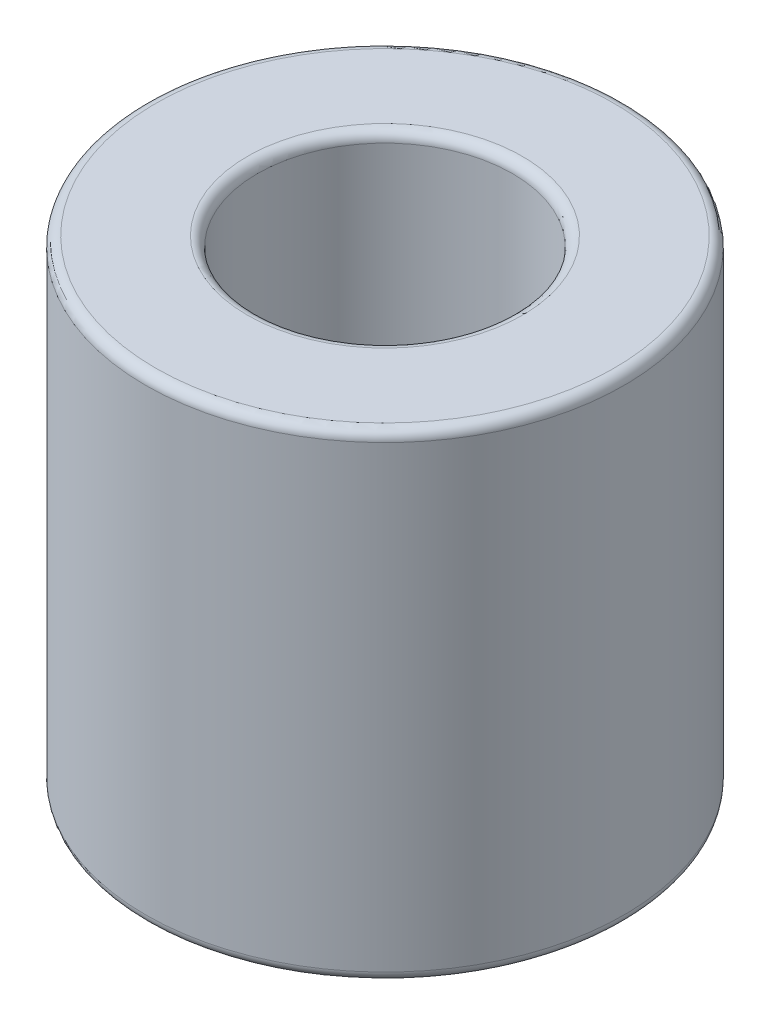
ISO-10303-21;
HEADER;
FILE_DESCRIPTION(('STEP AP214'),'2;1');
FILE_NAME('part.step','',(''),(''),'','','');
FILE_SCHEMA(('AUTOMOTIVE_DESIGN { 1 0 10303 214 1 1 1 1 }'));
ENDSEC;
DATA;
#1=APPLICATION_CONTEXT('core data for automotive mechanical design processes');
#2=APPLICATION_PROTOCOL_DEFINITION('international standard','automotive_design',2000,#1);
#3=PRODUCT_CONTEXT('',#1,'mechanical');
#4=PRODUCT('Part','Part','',(#3));
#5=PRODUCT_RELATED_PRODUCT_CATEGORY('part','',(#4));
#6=PRODUCT_DEFINITION_FORMATION('','',#4);
#7=PRODUCT_DEFINITION_CONTEXT('part definition',#1,'design');
#8=PRODUCT_DEFINITION('design','',#6,#7);
#9=PRODUCT_DEFINITION_SHAPE('','',#8);
#10=(LENGTH_UNIT() NAMED_UNIT(*) SI_UNIT(.MILLI.,.METRE.));
#11=(NAMED_UNIT(*) PLANE_ANGLE_UNIT() SI_UNIT($,.RADIAN.));
#12=(NAMED_UNIT(*) SI_UNIT($,.STERADIAN.) SOLID_ANGLE_UNIT());
#13=UNCERTAINTY_MEASURE_WITH_UNIT(LENGTH_MEASURE(1.E-05),#10,'distance_accuracy_value','');
#14=(GEOMETRIC_REPRESENTATION_CONTEXT(3) GLOBAL_UNCERTAINTY_ASSIGNED_CONTEXT((#13)) GLOBAL_UNIT_ASSIGNED_CONTEXT((#10,
#11,#12)) REPRESENTATION_CONTEXT('',''));
#15=CARTESIAN_POINT('',(0.,0.,0.));
#16=DIRECTION('',(0.,0.,1.));
#17=DIRECTION('',(1.,0.,0.));
#18=AXIS2_PLACEMENT_3D('',#15,#16,#17);
#19=CARTESIAN_POINT('',(0.,6.,0.));
#20=DIRECTION('',(0.,1.,0.));
#21=DIRECTION('',(0.,0.,1.));
#22=AXIS2_PLACEMENT_3D('',#19,#20,#21);
#23=PLANE('',#22);
#24=CARTESIAN_POINT('',(0.,6.,0.));
#25=DIRECTION('',(0.,1.,0.));
#26=DIRECTION('',(0.,0.,1.));
#27=AXIS2_PLACEMENT_3D('',#24,#25,#26);
#28=CIRCLE('',#27,1.725);
#29=CARTESIAN_POINT('',(0.,6.,1.725));
#30=VERTEX_POINT('',#29);
#31=EDGE_CURVE('E50',#30,#30,#28,.F.);
#32=ORIENTED_EDGE('',*,*,#31,.T.);
#33=EDGE_LOOP('',(#32));
#34=FACE_BOUND('',#33,.T.);
#35=CARTESIAN_POINT('',(0.,6.,0.));
#36=DIRECTION('',(0.,1.,0.));
#37=DIRECTION('',(0.,0.,1.));
#38=AXIS2_PLACEMENT_3D('',#35,#36,#37);
#39=CIRCLE('',#38,2.875);
#40=CARTESIAN_POINT('',(0.,6.,2.875));
#41=VERTEX_POINT('',#40);
#42=EDGE_CURVE('E54',#41,#41,#39,.T.);
#43=ORIENTED_EDGE('',*,*,#42,.T.);
#44=EDGE_LOOP('',(#43));
#45=FACE_BOUND('',#44,.T.);
#46=ADVANCED_FACE('F39',(#34,#45),#23,.T.);
#47=CARTESIAN_POINT('',(0.,0.,0.));
#48=DIRECTION('',(0.,1.,0.));
#49=DIRECTION('',(0.,0.,1.));
#50=AXIS2_PLACEMENT_3D('',#47,#48,#49);
#51=PLANE('',#50);
#52=CARTESIAN_POINT('',(0.,0.,0.));
#53=DIRECTION('',(0.,1.,0.));
#54=DIRECTION('',(0.,0.,1.));
#55=AXIS2_PLACEMENT_3D('',#52,#53,#54);
#56=CIRCLE('',#55,1.725);
#57=CARTESIAN_POINT('',(0.,0.,1.725));
#58=VERTEX_POINT('',#57);
#59=EDGE_CURVE('E65',#58,#58,#56,.T.);
#60=ORIENTED_EDGE('',*,*,#59,.T.);
#61=EDGE_LOOP('',(#60));
#62=FACE_BOUND('',#61,.T.);
#63=CARTESIAN_POINT('',(0.,0.,0.));
#64=DIRECTION('',(0.,1.,0.));
#65=DIRECTION('',(0.,0.,1.));
#66=AXIS2_PLACEMENT_3D('',#63,#64,#65);
#67=CIRCLE('',#66,2.875);
#68=CARTESIAN_POINT('',(0.,0.,2.875));
#69=VERTEX_POINT('',#68);
#70=EDGE_CURVE('E68',#69,#69,#67,.F.);
#71=ORIENTED_EDGE('',*,*,#70,.T.);
#72=EDGE_LOOP('',(#71));
#73=FACE_BOUND('',#72,.T.);
#74=ADVANCED_FACE('F72',(#62,#73),#51,.F.);
#75=CARTESIAN_POINT('',(0.,6.,0.));
#76=DIRECTION('',(0.,-1.,0.));
#77=DIRECTION('',(0.,0.,-1.));
#78=AXIS2_PLACEMENT_3D('',#75,#76,#77);
#79=CYLINDRICAL_SURFACE('',#78,3.);
#80=CARTESIAN_POINT('',(0.,0.125,0.));
#81=DIRECTION('',(0.,1.,0.));
#82=DIRECTION('',(0.,0.,1.));
#83=AXIS2_PLACEMENT_3D('',#80,#81,#82);
#84=CIRCLE('',#83,3.);
#85=CARTESIAN_POINT('',(0.,0.125,3.));
#86=VERTEX_POINT('',#85);
#87=EDGE_CURVE('E10',#86,#86,#84,.T.);
#88=ORIENTED_EDGE('',*,*,#87,.T.);
#89=EDGE_LOOP('',(#88));
#90=FACE_BOUND('',#89,.T.);
#91=CARTESIAN_POINT('',(0.,5.875,0.));
#92=DIRECTION('',(0.,1.,0.));
#93=DIRECTION('',(0.,0.,1.));
#94=AXIS2_PLACEMENT_3D('',#91,#92,#93);
#95=CIRCLE('',#94,3.);
#96=CARTESIAN_POINT('',(0.,5.875,3.));
#97=VERTEX_POINT('',#96);
#98=EDGE_CURVE('E46',#97,#97,#95,.F.);
#99=ORIENTED_EDGE('',*,*,#98,.T.);
#100=EDGE_LOOP('',(#99));
#101=FACE_BOUND('',#100,.T.);
#102=ADVANCED_FACE('F92',(#90,#101),#79,.T.);
#103=CARTESIAN_POINT('',(0.,6.,0.));
#104=DIRECTION('',(0.,-1.,0.));
#105=DIRECTION('',(0.,0.,-1.));
#106=AXIS2_PLACEMENT_3D('',#103,#104,#105);
#107=CYLINDRICAL_SURFACE('',#106,1.6);
#108=CARTESIAN_POINT('',(0.,0.125,0.));
#109=DIRECTION('',(0.,1.,0.));
#110=DIRECTION('',(0.,0.,1.));
#111=AXIS2_PLACEMENT_3D('',#108,#109,#110);
#112=CIRCLE('',#111,1.6);
#113=CARTESIAN_POINT('',(0.,0.125,1.6));
#114=VERTEX_POINT('',#113);
#115=EDGE_CURVE('E59',#114,#114,#112,.F.);
#116=ORIENTED_EDGE('',*,*,#115,.T.);
#117=EDGE_LOOP('',(#116));
#118=FACE_BOUND('',#117,.T.);
#119=CARTESIAN_POINT('',(0.,5.875,0.));
#120=DIRECTION('',(0.,1.,0.));
#121=DIRECTION('',(0.,0.,1.));
#122=AXIS2_PLACEMENT_3D('',#119,#120,#121);
#123=CIRCLE('',#122,1.6);
#124=CARTESIAN_POINT('',(0.,5.875,1.6));
#125=VERTEX_POINT('',#124);
#126=EDGE_CURVE('E62',#125,#125,#123,.T.);
#127=ORIENTED_EDGE('',*,*,#126,.T.);
#128=EDGE_LOOP('',(#127));
#129=FACE_BOUND('',#128,.T.);
#130=ADVANCED_FACE('F97',(#118,#129),#107,.F.);
#131=CARTESIAN_POINT('',(0.,0.125,0.));
#132=DIRECTION('',(0.,1.,0.));
#133=DIRECTION('',(0.,0.,1.));
#134=AXIS2_PLACEMENT_3D('',#131,#132,#133);
#135=TOROIDAL_SURFACE('',#134,1.725,0.125);
#136=ORIENTED_EDGE('',*,*,#115,.F.);
#137=EDGE_LOOP('',(#136));
#138=FACE_BOUND('',#137,.T.);
#139=ORIENTED_EDGE('',*,*,#59,.F.);
#140=EDGE_LOOP('',(#139));
#141=FACE_BOUND('',#140,.T.);
#142=ADVANCED_FACE('F83',(#138,#141),#135,.T.);
#143=CARTESIAN_POINT('',(0.,5.875,0.));
#144=DIRECTION('',(0.,1.,0.));
#145=DIRECTION('',(0.,0.,1.));
#146=AXIS2_PLACEMENT_3D('',#143,#144,#145);
#147=TOROIDAL_SURFACE('',#146,1.725,0.125);
#148=ORIENTED_EDGE('',*,*,#31,.F.);
#149=EDGE_LOOP('',(#148));
#150=FACE_BOUND('',#149,.T.);
#151=ORIENTED_EDGE('',*,*,#126,.F.);
#152=EDGE_LOOP('',(#151));
#153=FACE_BOUND('',#152,.T.);
#154=ADVANCED_FACE('F77',(#150,#153),#147,.T.);
#155=CARTESIAN_POINT('',(0.,0.125,0.));
#156=DIRECTION('',(0.,1.,0.));
#157=DIRECTION('',(0.,0.,1.));
#158=AXIS2_PLACEMENT_3D('',#155,#156,#157);
#159=TOROIDAL_SURFACE('',#158,2.875,0.125);
#160=ORIENTED_EDGE('',*,*,#70,.F.);
#161=EDGE_LOOP('',(#160));
#162=FACE_BOUND('',#161,.T.);
#163=ORIENTED_EDGE('',*,*,#87,.F.);
#164=EDGE_LOOP('',(#163));
#165=FACE_BOUND('',#164,.T.);
#166=ADVANCED_FACE('F74',(#162,#165),#159,.T.);
#167=CARTESIAN_POINT('',(0.,5.875,0.));
#168=DIRECTION('',(0.,1.,0.));
#169=DIRECTION('',(0.,0.,1.));
#170=AXIS2_PLACEMENT_3D('',#167,#168,#169);
#171=TOROIDAL_SURFACE('',#170,2.875,0.125);
#172=ORIENTED_EDGE('',*,*,#98,.F.);
#173=EDGE_LOOP('',(#172));
#174=FACE_BOUND('',#173,.T.);
#175=ORIENTED_EDGE('',*,*,#42,.F.);
#176=EDGE_LOOP('',(#175));
#177=FACE_BOUND('',#176,.T.);
#178=ADVANCED_FACE('F41',(#174,#177),#171,.T.);
#179=CLOSED_SHELL('',(#46,#74,#102,#130,#142,#154,#166,#178));
#180=MANIFOLD_SOLID_BREP('B2',#179);
#181=ADVANCED_BREP_SHAPE_REPRESENTATION('',(#18,#180),#14);
#182=SHAPE_DEFINITION_REPRESENTATION(#9,#181);
ENDSEC;
END-ISO-10303-21;
